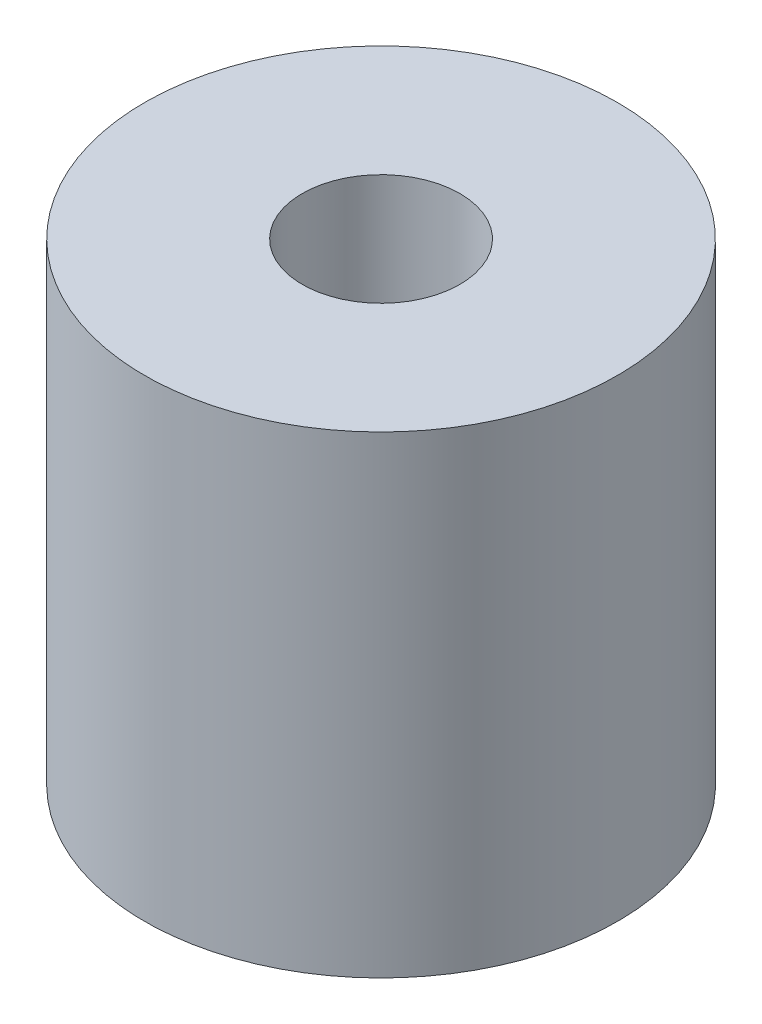
ISO-10303-21;
HEADER;
FILE_DESCRIPTION(('STEP AP214'),'2;1');
FILE_NAME('part.step','',(''),(''),'','','');
FILE_SCHEMA(('AUTOMOTIVE_DESIGN { 1 0 10303 214 1 1 1 1 }'));
ENDSEC;
DATA;
#1=APPLICATION_CONTEXT('core data for automotive mechanical design processes');
#2=APPLICATION_PROTOCOL_DEFINITION('international standard','automotive_design',2000,#1);
#3=PRODUCT_CONTEXT('',#1,'mechanical');
#4=PRODUCT('Part','Part','',(#3));
#5=PRODUCT_RELATED_PRODUCT_CATEGORY('part','',(#4));
#6=PRODUCT_DEFINITION_FORMATION('','',#4);
#7=PRODUCT_DEFINITION_CONTEXT('part definition',#1,'design');
#8=PRODUCT_DEFINITION('design','',#6,#7);
#9=PRODUCT_DEFINITION_SHAPE('','',#8);
#10=(LENGTH_UNIT() NAMED_UNIT(*) SI_UNIT(.MILLI.,.METRE.));
#11=(NAMED_UNIT(*) PLANE_ANGLE_UNIT() SI_UNIT($,.RADIAN.));
#12=(NAMED_UNIT(*) SI_UNIT($,.STERADIAN.) SOLID_ANGLE_UNIT());
#13=UNCERTAINTY_MEASURE_WITH_UNIT(LENGTH_MEASURE(1.E-05),#10,'distance_accuracy_value','');
#14=(GEOMETRIC_REPRESENTATION_CONTEXT(3) GLOBAL_UNCERTAINTY_ASSIGNED_CONTEXT((#13)) GLOBAL_UNIT_ASSIGNED_CONTEXT((#10,
#11,#12)) REPRESENTATION_CONTEXT('',''));
#15=CARTESIAN_POINT('',(0.,0.,0.));
#16=DIRECTION('',(0.,0.,1.));
#17=DIRECTION('',(1.,0.,0.));
#18=AXIS2_PLACEMENT_3D('',#15,#16,#17);
#19=CARTESIAN_POINT('',(0.,4.7625,0.));
#20=DIRECTION('',(0.,1.,0.));
#21=DIRECTION('',(0.,0.,1.));
#22=AXIS2_PLACEMENT_3D('',#19,#20,#21);
#23=PLANE('',#22);
#24=CARTESIAN_POINT('',(0.,4.7625,0.));
#25=DIRECTION('',(0.,1.,0.));
#26=DIRECTION('',(0.,0.,1.));
#27=AXIS2_PLACEMENT_3D('',#24,#25,#26);
#28=CIRCLE('',#27,2.38125);
#29=CARTESIAN_POINT('',(0.,4.7625,-2.38125));
#30=VERTEX_POINT('',#29);
#31=EDGE_CURVE('E10',#30,#30,#28,.T.);
#32=ORIENTED_EDGE('',*,*,#31,.T.);
#33=EDGE_LOOP('',(#32));
#34=FACE_BOUND('',#33,.T.);
#35=CARTESIAN_POINT('',(0.,4.7625,0.));
#36=DIRECTION('',(0.,1.,0.));
#37=DIRECTION('',(0.,0.,1.));
#38=AXIS2_PLACEMENT_3D('',#35,#36,#37);
#39=CIRCLE('',#38,0.79375);
#40=CARTESIAN_POINT('',(0.,4.7625,-0.79375));
#41=VERTEX_POINT('',#40);
#42=EDGE_CURVE('E46',#41,#41,#39,.T.);
#43=ORIENTED_EDGE('',*,*,#42,.F.);
#44=EDGE_LOOP('',(#43));
#45=FACE_BOUND('',#44,.T.);
#46=ADVANCED_FACE('F35',(#34,#45),#23,.T.);
#47=CARTESIAN_POINT('',(0.,0.,0.));
#48=DIRECTION('',(0.,1.,0.));
#49=DIRECTION('',(0.,0.,1.));
#50=AXIS2_PLACEMENT_3D('',#47,#48,#49);
#51=PLANE('',#50);
#52=CARTESIAN_POINT('',(0.,0.,0.));
#53=DIRECTION('',(0.,1.,0.));
#54=DIRECTION('',(0.,0.,1.));
#55=AXIS2_PLACEMENT_3D('',#52,#53,#54);
#56=CIRCLE('',#55,2.38125);
#57=CARTESIAN_POINT('',(0.,0.,-2.38125));
#58=VERTEX_POINT('',#57);
#59=EDGE_CURVE('E39',#58,#58,#56,.T.);
#60=ORIENTED_EDGE('',*,*,#59,.F.);
#61=EDGE_LOOP('',(#60));
#62=FACE_BOUND('',#61,.T.);
#63=CARTESIAN_POINT('',(0.,0.,0.));
#64=DIRECTION('',(0.,1.,0.));
#65=DIRECTION('',(0.,0.,1.));
#66=AXIS2_PLACEMENT_3D('',#63,#64,#65);
#67=CIRCLE('',#66,0.79375);
#68=CARTESIAN_POINT('',(0.,0.,-0.79375));
#69=VERTEX_POINT('',#68);
#70=EDGE_CURVE('E48',#69,#69,#67,.T.);
#71=ORIENTED_EDGE('',*,*,#70,.T.);
#72=EDGE_LOOP('',(#71));
#73=FACE_BOUND('',#72,.T.);
#74=ADVANCED_FACE('F58',(#62,#73),#51,.F.);
#75=CARTESIAN_POINT('',(0.,4.7625,0.));
#76=DIRECTION('',(0.,-1.,0.));
#77=DIRECTION('',(0.,0.,-1.));
#78=AXIS2_PLACEMENT_3D('',#75,#76,#77);
#79=CYLINDRICAL_SURFACE('',#78,2.38125);
#80=CARTESIAN_POINT('',(0.,4.7625,-2.38125));
#81=CARTESIAN_POINT('',(0.,4.712890625,-2.38125));
#82=CARTESIAN_POINT('',(0.,4.66328125,-2.38125));
#83=CARTESIAN_POINT('',(0.,4.5640625,-2.38125));
#84=CARTESIAN_POINT('',(0.,4.514453125,-2.38125));
#85=CARTESIAN_POINT('',(0.,4.415234375,-2.38125));
#86=CARTESIAN_POINT('',(0.,4.365625,-2.38125));
#87=CARTESIAN_POINT('',(0.,4.26640625,-2.38125));
#88=CARTESIAN_POINT('',(0.,4.216796875,-2.38125));
#89=CARTESIAN_POINT('',(0.,4.117578125,-2.38125));
#90=CARTESIAN_POINT('',(0.,4.06796875,-2.38125));
#91=CARTESIAN_POINT('',(0.,3.96875,-2.38125));
#92=CARTESIAN_POINT('',(0.,3.919140625,-2.38125));
#93=CARTESIAN_POINT('',(0.,3.819921875,-2.38125));
#94=CARTESIAN_POINT('',(0.,3.7703125,-2.38125));
#95=CARTESIAN_POINT('',(0.,3.67109375,-2.38125));
#96=CARTESIAN_POINT('',(0.,3.621484375,-2.38125));
#97=CARTESIAN_POINT('',(0.,3.522265625,-2.38125));
#98=CARTESIAN_POINT('',(0.,3.47265625,-2.38125));
#99=CARTESIAN_POINT('',(0.,3.3734375,-2.38125));
#100=CARTESIAN_POINT('',(0.,3.323828125,-2.38125));
#101=CARTESIAN_POINT('',(0.,3.224609375,-2.38125));
#102=CARTESIAN_POINT('',(0.,3.175,-2.38125));
#103=CARTESIAN_POINT('',(0.,3.07578125,-2.38125));
#104=CARTESIAN_POINT('',(0.,3.026171875,-2.38125));
#105=CARTESIAN_POINT('',(0.,2.926953125,-2.38125));
#106=CARTESIAN_POINT('',(0.,2.87734375,-2.38125));
#107=CARTESIAN_POINT('',(0.,2.778125,-2.38125));
#108=CARTESIAN_POINT('',(0.,2.728515625,-2.38125));
#109=CARTESIAN_POINT('',(0.,2.629296875,-2.38125));
#110=CARTESIAN_POINT('',(0.,2.5796875,-2.38125));
#111=CARTESIAN_POINT('',(0.,2.48046875,-2.38125));
#112=CARTESIAN_POINT('',(0.,2.430859375,-2.38125));
#113=CARTESIAN_POINT('',(0.,2.331640625,-2.38125));
#114=CARTESIAN_POINT('',(0.,2.28203125,-2.38125));
#115=CARTESIAN_POINT('',(0.,2.1828125,-2.38125));
#116=CARTESIAN_POINT('',(0.,2.133203125,-2.38125));
#117=CARTESIAN_POINT('',(0.,2.033984375,-2.38125));
#118=CARTESIAN_POINT('',(0.,1.984375,-2.38125));
#119=CARTESIAN_POINT('',(0.,1.88515625,-2.38125));
#120=CARTESIAN_POINT('',(0.,1.835546875,-2.38125));
#121=CARTESIAN_POINT('',(0.,1.736328125,-2.38125));
#122=CARTESIAN_POINT('',(0.,1.68671875,-2.38125));
#123=CARTESIAN_POINT('',(0.,1.5875,-2.38125));
#124=CARTESIAN_POINT('',(0.,1.537890625,-2.38125));
#125=CARTESIAN_POINT('',(0.,1.438671875,-2.38125));
#126=CARTESIAN_POINT('',(0.,1.3890625,-2.38125));
#127=CARTESIAN_POINT('',(0.,1.28984375,-2.38125));
#128=CARTESIAN_POINT('',(0.,1.240234375,-2.38125));
#129=CARTESIAN_POINT('',(0.,1.141015625,-2.38125));
#130=CARTESIAN_POINT('',(0.,1.09140625,-2.38125));
#131=CARTESIAN_POINT('',(0.,0.992187499999999,-2.38125));
#132=CARTESIAN_POINT('',(0.,0.942578124999999,-2.38125));
#133=CARTESIAN_POINT('',(0.,0.843359375,-2.38125));
#134=CARTESIAN_POINT('',(0.,0.79375,-2.38125));
#135=CARTESIAN_POINT('',(0.,0.69453125,-2.38125));
#136=CARTESIAN_POINT('',(0.,0.644921875,-2.38125));
#137=CARTESIAN_POINT('',(0.,0.545703125,-2.38125));
#138=CARTESIAN_POINT('',(0.,0.49609375,-2.38125));
#139=CARTESIAN_POINT('',(0.,0.396875,-2.38125));
#140=CARTESIAN_POINT('',(0.,0.347265625,-2.38125));
#141=CARTESIAN_POINT('',(0.,0.248046875,-2.38125));
#142=CARTESIAN_POINT('',(0.,0.1984375,-2.38125));
#143=CARTESIAN_POINT('',(0.,0.09921875,-2.38125));
#144=CARTESIAN_POINT('',(0.,0.049609375,-2.38125));
#145=CARTESIAN_POINT('',(0.,0.,-2.38125));
#146=B_SPLINE_CURVE_WITH_KNOTS('',3,(#80,#81,#82,#83,#84,#85,#86,#87,#88,#89,#90,#91,#92,#93,
#94,#95,#96,#97,#98,#99,#100,#101,#102,#103,#104,#105,#106,#107,#108,#109,#110,#111,#112,#113,
#114,#115,#116,#117,#118,#119,#120,#121,#122,#123,#124,#125,#126,#127,#128,#129,#130,#131,#132,
#133,#134,#135,#136,#137,#138,#139,#140,#141,#142,#143,#144,#145),.UNSPECIFIED.,.F.,.F.,(4,2,2,
2,2,2,2,2,2,2,2,2,2,2,2,2,2,2,2,2,2,2,2,2,2,2,2,2,2,2,2,2,4),(0.,0.148828125,0.29765625,
0.446484375,0.5953125,0.744140625,0.892968750000001,1.041796875,1.190625,1.339453125,1.48828125,
1.637109375,1.7859375,1.934765625,2.08359375,2.232421875,2.38125,2.530078125,2.67890625,
2.827734375,2.9765625,3.125390625,3.27421875,3.423046875,3.571875,3.720703125,3.86953125,
4.018359375,4.1671875,4.316015625,4.46484375,4.613671875,4.7625),.UNSPECIFIED.);
#147=EDGE_CURVE('BSEAM37',#30,#58,#146,.T.);
#148=ORIENTED_EDGE('',*,*,#31,.F.);
#149=ORIENTED_EDGE('',*,*,#59,.T.);
#150=ORIENTED_EDGE('',*,*,#147,.T.);
#151=ORIENTED_EDGE('',*,*,#147,.F.);
#152=EDGE_LOOP('',(#148,#150,#149,#151));
#153=FACE_BOUND('',#152,.T.);
#154=ADVANCED_FACE('F37',(#153),#79,.T.);
#155=CARTESIAN_POINT('',(0.,4.7625,0.));
#156=DIRECTION('',(0.,-1.,0.));
#157=DIRECTION('',(0.,0.,-1.));
#158=AXIS2_PLACEMENT_3D('',#155,#156,#157);
#159=CYLINDRICAL_SURFACE('',#158,0.79375);
#160=CARTESIAN_POINT('',(0.,4.7625,-0.79375));
#161=CARTESIAN_POINT('',(0.,4.712890625,-0.79375));
#162=CARTESIAN_POINT('',(0.,4.66328125,-0.79375));
#163=CARTESIAN_POINT('',(0.,4.5640625,-0.79375));
#164=CARTESIAN_POINT('',(0.,4.514453125,-0.79375));
#165=CARTESIAN_POINT('',(0.,4.415234375,-0.79375));
#166=CARTESIAN_POINT('',(0.,4.365625,-0.79375));
#167=CARTESIAN_POINT('',(0.,4.26640625,-0.79375));
#168=CARTESIAN_POINT('',(0.,4.216796875,-0.79375));
#169=CARTESIAN_POINT('',(0.,4.117578125,-0.79375));
#170=CARTESIAN_POINT('',(0.,4.06796875,-0.79375));
#171=CARTESIAN_POINT('',(0.,3.96875,-0.79375));
#172=CARTESIAN_POINT('',(0.,3.919140625,-0.79375));
#173=CARTESIAN_POINT('',(0.,3.819921875,-0.79375));
#174=CARTESIAN_POINT('',(0.,3.7703125,-0.79375));
#175=CARTESIAN_POINT('',(0.,3.67109375,-0.79375));
#176=CARTESIAN_POINT('',(0.,3.621484375,-0.79375));
#177=CARTESIAN_POINT('',(0.,3.522265625,-0.79375));
#178=CARTESIAN_POINT('',(0.,3.47265625,-0.79375));
#179=CARTESIAN_POINT('',(0.,3.3734375,-0.79375));
#180=CARTESIAN_POINT('',(0.,3.323828125,-0.79375));
#181=CARTESIAN_POINT('',(0.,3.224609375,-0.79375));
#182=CARTESIAN_POINT('',(0.,3.175,-0.79375));
#183=CARTESIAN_POINT('',(0.,3.07578125,-0.79375));
#184=CARTESIAN_POINT('',(0.,3.026171875,-0.79375));
#185=CARTESIAN_POINT('',(0.,2.926953125,-0.79375));
#186=CARTESIAN_POINT('',(0.,2.87734375,-0.79375));
#187=CARTESIAN_POINT('',(0.,2.778125,-0.79375));
#188=CARTESIAN_POINT('',(0.,2.728515625,-0.79375));
#189=CARTESIAN_POINT('',(0.,2.629296875,-0.79375));
#190=CARTESIAN_POINT('',(0.,2.5796875,-0.79375));
#191=CARTESIAN_POINT('',(0.,2.48046875,-0.79375));
#192=CARTESIAN_POINT('',(0.,2.430859375,-0.79375));
#193=CARTESIAN_POINT('',(0.,2.331640625,-0.79375));
#194=CARTESIAN_POINT('',(0.,2.28203125,-0.79375));
#195=CARTESIAN_POINT('',(0.,2.1828125,-0.79375));
#196=CARTESIAN_POINT('',(0.,2.133203125,-0.79375));
#197=CARTESIAN_POINT('',(0.,2.033984375,-0.79375));
#198=CARTESIAN_POINT('',(0.,1.984375,-0.79375));
#199=CARTESIAN_POINT('',(0.,1.88515625,-0.79375));
#200=CARTESIAN_POINT('',(0.,1.835546875,-0.79375));
#201=CARTESIAN_POINT('',(0.,1.736328125,-0.79375));
#202=CARTESIAN_POINT('',(0.,1.68671875,-0.79375));
#203=CARTESIAN_POINT('',(0.,1.5875,-0.79375));
#204=CARTESIAN_POINT('',(0.,1.537890625,-0.79375));
#205=CARTESIAN_POINT('',(0.,1.438671875,-0.79375));
#206=CARTESIAN_POINT('',(0.,1.3890625,-0.79375));
#207=CARTESIAN_POINT('',(0.,1.28984375,-0.79375));
#208=CARTESIAN_POINT('',(0.,1.240234375,-0.79375));
#209=CARTESIAN_POINT('',(0.,1.141015625,-0.79375));
#210=CARTESIAN_POINT('',(0.,1.09140625,-0.79375));
#211=CARTESIAN_POINT('',(0.,0.9921875,-0.79375));
#212=CARTESIAN_POINT('',(0.,0.942578125,-0.79375));
#213=CARTESIAN_POINT('',(0.,0.843359375,-0.79375));
#214=CARTESIAN_POINT('',(0.,0.79375,-0.79375));
#215=CARTESIAN_POINT('',(0.,0.69453125,-0.79375));
#216=CARTESIAN_POINT('',(0.,0.644921875,-0.79375));
#217=CARTESIAN_POINT('',(0.,0.545703125,-0.79375));
#218=CARTESIAN_POINT('',(0.,0.49609375,-0.79375));
#219=CARTESIAN_POINT('',(0.,0.396875,-0.79375));
#220=CARTESIAN_POINT('',(0.,0.347265625,-0.79375));
#221=CARTESIAN_POINT('',(0.,0.248046875,-0.79375));
#222=CARTESIAN_POINT('',(0.,0.1984375,-0.79375));
#223=CARTESIAN_POINT('',(0.,0.09921875,-0.79375));
#224=CARTESIAN_POINT('',(0.,0.049609375,-0.79375));
#225=CARTESIAN_POINT('',(0.,0.,-0.79375));
#226=B_SPLINE_CURVE_WITH_KNOTS('',3,(#160,#161,#162,#163,#164,#165,#166,#167,#168,#169,#170,
#171,#172,#173,#174,#175,#176,#177,#178,#179,#180,#181,#182,#183,#184,#185,#186,#187,#188,#189,
#190,#191,#192,#193,#194,#195,#196,#197,#198,#199,#200,#201,#202,#203,#204,#205,#206,#207,#208,
#209,#210,#211,#212,#213,#214,#215,#216,#217,#218,#219,#220,#221,#222,#223,#224,#225),
.UNSPECIFIED.,.F.,.F.,(4,2,2,2,2,2,2,2,2,2,2,2,2,2,2,2,2,2,2,2,2,2,2,2,2,2,2,2,2,2,2,2,4),(0.,
0.148828124999999,0.297656249999999,0.446484374999999,0.595312499999999,0.744140625,0.89296875,
1.041796875,1.190625,1.339453125,1.48828125,1.637109375,1.7859375,1.934765625,2.08359375,
2.232421875,2.38125,2.530078125,2.67890625,2.827734375,2.9765625,3.125390625,3.27421875,
3.423046875,3.571875,3.720703125,3.86953125,4.018359375,4.1671875,4.316015625,4.46484375,
4.613671875,4.7625),.UNSPECIFIED.);
#227=EDGE_CURVE('BSEAM54',#41,#69,#226,.T.);
#228=ORIENTED_EDGE('',*,*,#42,.T.);
#229=ORIENTED_EDGE('',*,*,#70,.F.);
#230=ORIENTED_EDGE('',*,*,#227,.T.);
#231=ORIENTED_EDGE('',*,*,#227,.F.);
#232=EDGE_LOOP('',(#228,#230,#229,#231));
#233=FACE_BOUND('',#232,.T.);
#234=ADVANCED_FACE('F54',(#233),#159,.F.);
#235=CLOSED_SHELL('',(#46,#74,#154,#234));
#236=MANIFOLD_SOLID_BREP('B2',#235);
#237=ADVANCED_BREP_SHAPE_REPRESENTATION('',(#18,#236),#14);
#238=SHAPE_DEFINITION_REPRESENTATION(#9,#237);
ENDSEC;
END-ISO-10303-21;
